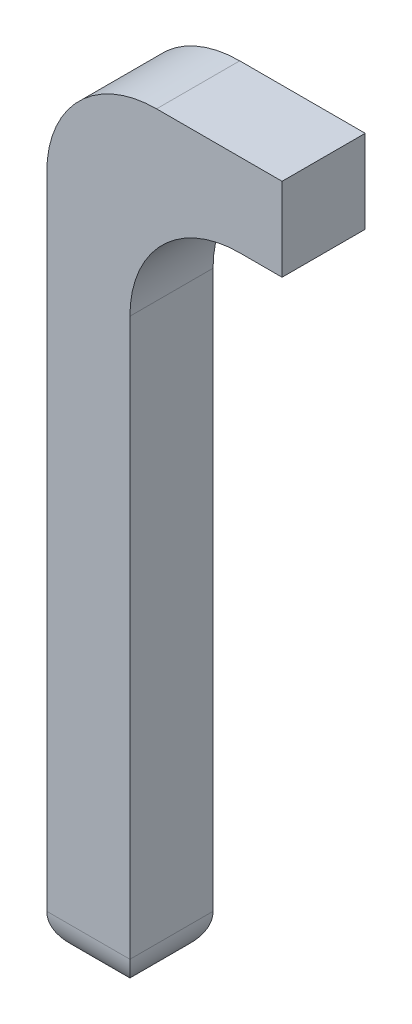
ISO-10303-21;
HEADER;
FILE_DESCRIPTION(('STEP AP214'),'2;1');
FILE_NAME('part.step','',(''),(''),'','','');
FILE_SCHEMA(('AUTOMOTIVE_DESIGN { 1 0 10303 214 1 1 1 1 }'));
ENDSEC;
DATA;
#1=APPLICATION_CONTEXT('core data for automotive mechanical design processes');
#2=APPLICATION_PROTOCOL_DEFINITION('international standard','automotive_design',2000,#1);
#3=PRODUCT_CONTEXT('',#1,'mechanical');
#4=PRODUCT('Part','Part','',(#3));
#5=PRODUCT_RELATED_PRODUCT_CATEGORY('part','',(#4));
#6=PRODUCT_DEFINITION_FORMATION('','',#4);
#7=PRODUCT_DEFINITION_CONTEXT('part definition',#1,'design');
#8=PRODUCT_DEFINITION('design','',#6,#7);
#9=PRODUCT_DEFINITION_SHAPE('','',#8);
#10=(LENGTH_UNIT() NAMED_UNIT(*) SI_UNIT(.MILLI.,.METRE.));
#11=(NAMED_UNIT(*) PLANE_ANGLE_UNIT() SI_UNIT($,.RADIAN.));
#12=(NAMED_UNIT(*) SI_UNIT($,.STERADIAN.) SOLID_ANGLE_UNIT());
#13=UNCERTAINTY_MEASURE_WITH_UNIT(LENGTH_MEASURE(1.E-05),#10,'distance_accuracy_value','');
#14=(GEOMETRIC_REPRESENTATION_CONTEXT(3) GLOBAL_UNCERTAINTY_ASSIGNED_CONTEXT((#13)) GLOBAL_UNIT_ASSIGNED_CONTEXT((#10,
#11,#12)) REPRESENTATION_CONTEXT('',''));
#15=CARTESIAN_POINT('',(0.,0.,0.));
#16=DIRECTION('',(0.,0.,1.));
#17=DIRECTION('',(1.,0.,0.));
#18=AXIS2_PLACEMENT_3D('',#15,#16,#17);
#19=CARTESIAN_POINT('',(10.4,-0.4,9.7625));
#20=DIRECTION('',(0.,0.,1.));
#21=DIRECTION('',(0.707106781186548,-0.707106781186548,0.));
#22=AXIS2_PLACEMENT_3D('',#19,#20,#21);
#23=CYLINDRICAL_SURFACE('',#22,0.25);
#24=DIRECTION('',(0.,0.,-1.));
#25=VECTOR('',#24,1.);
#26=CARTESIAN_POINT('',(10.4,-0.65,9.7625));
#27=LINE('',#26,#25);
#28=CARTESIAN_POINT('',(10.4,-0.65,9.91));
#29=VERTEX_POINT('',#28);
#30=CARTESIAN_POINT('',(10.4,-0.65,9.88));
#31=VERTEX_POINT('',#30);
#32=EDGE_CURVE('E11',#29,#31,#27,.T.);
#33=ORIENTED_EDGE('',*,*,#32,.T.);
#34=CARTESIAN_POINT('',(10.4,-0.4,9.88));
#35=DIRECTION('',(0.707106781186548,0.,0.707106781186548));
#36=DIRECTION('',(0.707106781186548,0.,-0.707106781186548));
#37=AXIS2_PLACEMENT_3D('',#34,#35,#36);
#38=ELLIPSE('',#37,0.353553390593,0.25);
#39=CARTESIAN_POINT('',(10.65,-0.4,9.63));
#40=VERTEX_POINT('',#39);
#41=EDGE_CURVE('E27',#31,#40,#38,.T.);
#42=ORIENTED_EDGE('',*,*,#41,.T.);
#43=DIRECTION('',(0.,0.,1.));
#44=VECTOR('',#43,1.);
#45=CARTESIAN_POINT('',(10.65,-0.4,9.7625));
#46=LINE('',#45,#44);
#47=CARTESIAN_POINT('',(10.65,-0.4,10.16));
#48=VERTEX_POINT('',#47);
#49=EDGE_CURVE('E174',#40,#48,#46,.T.);
#50=ORIENTED_EDGE('',*,*,#49,.T.);
#51=CARTESIAN_POINT('',(10.4,-0.4,9.91));
#52=DIRECTION('',(-0.707106781186548,0.,0.707106781186548));
#53=DIRECTION('',(0.707106781186548,0.,0.707106781186548));
#54=AXIS2_PLACEMENT_3D('',#51,#52,#53);
#55=ELLIPSE('',#54,0.353553390593,0.25);
#56=EDGE_CURVE('E134',#29,#48,#55,.T.);
#57=ORIENTED_EDGE('',*,*,#56,.F.);
#58=EDGE_LOOP('',(#33,#42,#50,#57));
#59=FACE_BOUND('',#58,.T.);
#60=ADVANCED_FACE('F17',(#59),#23,.T.);
#61=CARTESIAN_POINT('',(11.0025,-0.4,9.88));
#62=DIRECTION('',(1.,0.,0.));
#63=DIRECTION('',(0.,-0.707106781186548,-0.707106781186548));
#64=AXIS2_PLACEMENT_3D('',#61,#62,#63);
#65=CYLINDRICAL_SURFACE('',#64,0.25);
#66=DIRECTION('',(-1.,0.,0.));
#67=VECTOR('',#66,1.);
#68=CARTESIAN_POINT('',(11.0025,-0.65,9.88));
#69=LINE('',#68,#67);
#70=CARTESIAN_POINT('',(10.37,-0.65,9.88));
#71=VERTEX_POINT('',#70);
#72=EDGE_CURVE('E169',#31,#71,#69,.T.);
#73=ORIENTED_EDGE('',*,*,#72,.T.);
#74=CARTESIAN_POINT('',(10.37,-0.4,9.88));
#75=DIRECTION('',(0.707106781186548,0.,-0.707106781186548));
#76=DIRECTION('',(-0.707106781186548,0.,-0.707106781186548));
#77=AXIS2_PLACEMENT_3D('',#74,#75,#76);
#78=ELLIPSE('',#77,0.353553390593,0.25);
#79=CARTESIAN_POINT('',(10.12,-0.4,9.63));
#80=VERTEX_POINT('',#79);
#81=EDGE_CURVE('E164',#71,#80,#78,.T.);
#82=ORIENTED_EDGE('',*,*,#81,.T.);
#83=DIRECTION('',(1.,0.,0.));
#84=VECTOR('',#83,1.);
#85=CARTESIAN_POINT('',(11.0025,-0.4,9.63));
#86=LINE('',#85,#84);
#87=EDGE_CURVE('E161',#80,#40,#86,.T.);
#88=ORIENTED_EDGE('',*,*,#87,.T.);
#89=ORIENTED_EDGE('',*,*,#41,.F.);
#90=EDGE_LOOP('',(#73,#82,#88,#89));
#91=FACE_BOUND('',#90,.T.);
#92=ADVANCED_FACE('F167',(#91),#65,.T.);
#93=CARTESIAN_POINT('',(10.37,-0.4,9.895));
#94=DIRECTION('',(0.,0.,-1.));
#95=DIRECTION('',(-0.707106781186548,-0.707106781186548,0.));
#96=AXIS2_PLACEMENT_3D('',#93,#94,#95);
#97=CYLINDRICAL_SURFACE('',#96,0.25);
#98=DIRECTION('',(0.,0.,1.));
#99=VECTOR('',#98,1.);
#100=CARTESIAN_POINT('',(10.37,-0.65,9.895));
#101=LINE('',#100,#99);
#102=CARTESIAN_POINT('',(10.37,-0.65,9.91));
#103=VERTEX_POINT('',#102);
#104=EDGE_CURVE('E165',#71,#103,#101,.T.);
#105=ORIENTED_EDGE('',*,*,#104,.T.);
#106=CARTESIAN_POINT('',(10.37,-0.4,9.91));
#107=DIRECTION('',(-0.707106781186548,0.,-0.707106781186548));
#108=DIRECTION('',(-0.707106781186548,0.,0.707106781186548));
#109=AXIS2_PLACEMENT_3D('',#106,#107,#108);
#110=ELLIPSE('',#109,0.353553390593,0.25);
#111=CARTESIAN_POINT('',(10.12,-0.4,10.16));
#112=VERTEX_POINT('',#111);
#113=EDGE_CURVE('E179',#103,#112,#110,.T.);
#114=ORIENTED_EDGE('',*,*,#113,.T.);
#115=DIRECTION('',(0.,0.,-1.));
#116=VECTOR('',#115,1.);
#117=CARTESIAN_POINT('',(10.12,-0.4,9.895));
#118=LINE('',#117,#116);
#119=EDGE_CURVE('E158',#112,#80,#118,.T.);
#120=ORIENTED_EDGE('',*,*,#119,.T.);
#121=ORIENTED_EDGE('',*,*,#81,.F.);
#122=EDGE_LOOP('',(#105,#114,#120,#121));
#123=FACE_BOUND('',#122,.T.);
#124=ADVANCED_FACE('F205',(#123),#97,.T.);
#125=CARTESIAN_POINT('',(11.0025,-0.4,9.91));
#126=DIRECTION('',(-1.,0.,0.));
#127=DIRECTION('',(0.,-0.707106781186548,0.707106781186548));
#128=AXIS2_PLACEMENT_3D('',#125,#126,#127);
#129=CYLINDRICAL_SURFACE('',#128,0.25);
#130=DIRECTION('',(-1.,0.,0.));
#131=VECTOR('',#130,1.);
#132=CARTESIAN_POINT('',(11.0025,-0.4,10.16));
#133=LINE('',#132,#131);
#134=EDGE_CURVE('E182',#48,#112,#133,.T.);
#135=ORIENTED_EDGE('',*,*,#134,.T.);
#136=ORIENTED_EDGE('',*,*,#113,.F.);
#137=DIRECTION('',(1.,0.,0.));
#138=VECTOR('',#137,1.);
#139=CARTESIAN_POINT('',(11.0025,-0.65,9.91));
#140=LINE('',#139,#138);
#141=EDGE_CURVE('E184',#103,#29,#140,.T.);
#142=ORIENTED_EDGE('',*,*,#141,.T.);
#143=ORIENTED_EDGE('',*,*,#56,.T.);
#144=EDGE_LOOP('',(#135,#136,#142,#143));
#145=FACE_BOUND('',#144,.T.);
#146=ADVANCED_FACE('F201',(#145),#129,.T.);
#147=CARTESIAN_POINT('',(11.62,3.85,10.16));
#148=DIRECTION('',(0.,0.,1.));
#149=DIRECTION('',(0.,1.,0.));
#150=AXIS2_PLACEMENT_3D('',#147,#148,#149);
#151=PLANE('',#150);
#152=ORIENTED_EDGE('',*,*,#134,.F.);
#153=DIRECTION('',(0.,-1.,0.));
#154=VECTOR('',#153,1.);
#155=CARTESIAN_POINT('',(10.65,3.85,10.16));
#156=LINE('',#155,#154);
#157=CARTESIAN_POINT('',(10.65,3.15,10.16));
#158=VERTEX_POINT('',#157);
#159=EDGE_CURVE('E142',#158,#48,#156,.T.);
#160=ORIENTED_EDGE('',*,*,#159,.F.);
#161=CARTESIAN_POINT('',(11.35,3.15,10.16));
#162=DIRECTION('',(0.,0.,1.));
#163=DIRECTION('',(-0.707106781186548,0.707106781186548,0.));
#164=AXIS2_PLACEMENT_3D('',#161,#162,#163);
#165=CIRCLE('',#164,0.7);
#166=CARTESIAN_POINT('',(11.35,3.85,10.16));
#167=VERTEX_POINT('',#166);
#168=EDGE_CURVE('E144',#167,#158,#165,.T.);
#169=ORIENTED_EDGE('',*,*,#168,.F.);
#170=DIRECTION('',(-1.,0.,0.));
#171=VECTOR('',#170,1.);
#172=CARTESIAN_POINT('',(11.62,3.85,10.16));
#173=LINE('',#172,#171);
#174=CARTESIAN_POINT('',(11.62,3.85,10.16));
#175=VERTEX_POINT('',#174);
#176=EDGE_CURVE('E115',#175,#167,#173,.T.);
#177=ORIENTED_EDGE('',*,*,#176,.F.);
#178=DIRECTION('',(0.,-1.,0.));
#179=VECTOR('',#178,1.);
#180=CARTESIAN_POINT('',(11.62,4.38,10.16));
#181=LINE('',#180,#179);
#182=CARTESIAN_POINT('',(11.62,4.38,10.16));
#183=VERTEX_POINT('',#182);
#184=EDGE_CURVE('E123',#183,#175,#181,.T.);
#185=ORIENTED_EDGE('',*,*,#184,.F.);
#186=DIRECTION('',(-1.,0.,0.));
#187=VECTOR('',#186,1.);
#188=CARTESIAN_POINT('',(11.62,4.38,10.16));
#189=LINE('',#188,#187);
#190=CARTESIAN_POINT('',(10.82,4.38,10.16));
#191=VERTEX_POINT('',#190);
#192=EDGE_CURVE('E131',#183,#191,#189,.T.);
#193=ORIENTED_EDGE('',*,*,#192,.T.);
#194=CARTESIAN_POINT('',(10.82,3.68,10.16));
#195=DIRECTION('',(0.,0.,-1.));
#196=DIRECTION('',(-0.707106781186548,0.707106781186548,0.));
#197=AXIS2_PLACEMENT_3D('',#194,#195,#196);
#198=CIRCLE('',#197,0.7);
#199=CARTESIAN_POINT('',(10.12,3.68,10.16));
#200=VERTEX_POINT('',#199);
#201=EDGE_CURVE('E136',#200,#191,#198,.T.);
#202=ORIENTED_EDGE('',*,*,#201,.F.);
#203=DIRECTION('',(0.,-1.,0.));
#204=VECTOR('',#203,1.);
#205=CARTESIAN_POINT('',(10.12,3.85,10.16));
#206=LINE('',#205,#204);
#207=EDGE_CURVE('E135',#200,#112,#206,.T.);
#208=ORIENTED_EDGE('',*,*,#207,.T.);
#209=EDGE_LOOP('',(#152,#160,#169,#177,#185,#193,#202,#208));
#210=FACE_BOUND('',#209,.T.);
#211=ADVANCED_FACE('F191',(#210),#151,.T.);
#212=CARTESIAN_POINT('',(10.65,3.85,9.63));
#213=DIRECTION('',(1.,0.,0.));
#214=DIRECTION('',(0.,0.,1.));
#215=AXIS2_PLACEMENT_3D('',#212,#213,#214);
#216=PLANE('',#215);
#217=ORIENTED_EDGE('',*,*,#49,.F.);
#218=DIRECTION('',(0.,-1.,0.));
#219=VECTOR('',#218,1.);
#220=CARTESIAN_POINT('',(10.65,3.85,9.63));
#221=LINE('',#220,#219);
#222=CARTESIAN_POINT('',(10.65,3.15,9.63));
#223=VERTEX_POINT('',#222);
#224=EDGE_CURVE('E111',#223,#40,#221,.T.);
#225=ORIENTED_EDGE('',*,*,#224,.F.);
#226=DIRECTION('',(0.,0.,-1.));
#227=VECTOR('',#226,1.);
#228=CARTESIAN_POINT('',(10.65,3.15,9.63));
#229=LINE('',#228,#227);
#230=EDGE_CURVE('E100',#158,#223,#229,.T.);
#231=ORIENTED_EDGE('',*,*,#230,.F.);
#232=ORIENTED_EDGE('',*,*,#159,.T.);
#233=EDGE_LOOP('',(#217,#225,#231,#232));
#234=FACE_BOUND('',#233,.T.);
#235=ADVANCED_FACE('F194',(#234),#216,.T.);
#236=CARTESIAN_POINT('',(10.385,-0.65,9.895));
#237=DIRECTION('',(0.,-1.,0.));
#238=DIRECTION('',(0.,0.,-1.));
#239=AXIS2_PLACEMENT_3D('',#236,#237,#238);
#240=PLANE('',#239);
#241=ORIENTED_EDGE('',*,*,#32,.F.);
#242=ORIENTED_EDGE('',*,*,#141,.F.);
#243=ORIENTED_EDGE('',*,*,#104,.F.);
#244=ORIENTED_EDGE('',*,*,#72,.F.);
#245=EDGE_LOOP('',(#241,#242,#243,#244));
#246=FACE_BOUND('',#245,.T.);
#247=ADVANCED_FACE('F204',(#246),#240,.T.);
#248=CARTESIAN_POINT('',(10.82,3.68,10.0275));
#249=DIRECTION('',(0.,0.,-1.));
#250=DIRECTION('',(-0.707106781186548,0.707106781186548,0.));
#251=AXIS2_PLACEMENT_3D('',#248,#249,#250);
#252=CYLINDRICAL_SURFACE('',#251,0.7);
#253=CARTESIAN_POINT('',(10.82,3.68,9.63));
#254=DIRECTION('',(0.,0.,1.));
#255=DIRECTION('',(-0.707106781186548,0.707106781186548,0.));
#256=AXIS2_PLACEMENT_3D('',#253,#254,#255);
#257=CIRCLE('',#256,0.7);
#258=CARTESIAN_POINT('',(10.82,4.38,9.63));
#259=VERTEX_POINT('',#258);
#260=CARTESIAN_POINT('',(10.12,3.68,9.63));
#261=VERTEX_POINT('',#260);
#262=EDGE_CURVE('E146',#259,#261,#257,.T.);
#263=ORIENTED_EDGE('',*,*,#262,.T.);
#264=DIRECTION('',(0.,0.,1.));
#265=VECTOR('',#264,1.);
#266=CARTESIAN_POINT('',(10.12,3.68,10.0275));
#267=LINE('',#266,#265);
#268=EDGE_CURVE('E138',#261,#200,#267,.T.);
#269=ORIENTED_EDGE('',*,*,#268,.T.);
#270=ORIENTED_EDGE('',*,*,#201,.T.);
#271=DIRECTION('',(0.,0.,-1.));
#272=VECTOR('',#271,1.);
#273=CARTESIAN_POINT('',(10.82,4.38,10.0275));
#274=LINE('',#273,#272);
#275=EDGE_CURVE('E139',#191,#259,#274,.T.);
#276=ORIENTED_EDGE('',*,*,#275,.T.);
#277=EDGE_LOOP('',(#263,#269,#270,#276));
#278=FACE_BOUND('',#277,.T.);
#279=ADVANCED_FACE('F207',(#278),#252,.T.);
#280=CARTESIAN_POINT('',(10.12,4.115,9.895));
#281=DIRECTION('',(-1.,0.,0.));
#282=DIRECTION('',(0.,0.,1.));
#283=AXIS2_PLACEMENT_3D('',#280,#281,#282);
#284=PLANE('',#283);
#285=ORIENTED_EDGE('',*,*,#119,.F.);
#286=ORIENTED_EDGE('',*,*,#207,.F.);
#287=ORIENTED_EDGE('',*,*,#268,.F.);
#288=DIRECTION('',(0.,-1.,0.));
#289=VECTOR('',#288,1.);
#290=CARTESIAN_POINT('',(10.12,3.85,9.63));
#291=LINE('',#290,#289);
#292=EDGE_CURVE('E110',#261,#80,#291,.T.);
#293=ORIENTED_EDGE('',*,*,#292,.T.);
#294=EDGE_LOOP('',(#285,#286,#287,#293));
#295=FACE_BOUND('',#294,.T.);
#296=ADVANCED_FACE('F156',(#295),#284,.T.);
#297=CARTESIAN_POINT('',(11.62,4.38,9.63));
#298=DIRECTION('',(0.,0.,-1.));
#299=DIRECTION('',(0.,-1.,0.));
#300=AXIS2_PLACEMENT_3D('',#297,#298,#299);
#301=PLANE('',#300);
#302=ORIENTED_EDGE('',*,*,#87,.F.);
#303=ORIENTED_EDGE('',*,*,#292,.F.);
#304=ORIENTED_EDGE('',*,*,#262,.F.);
#305=DIRECTION('',(-1.,0.,0.));
#306=VECTOR('',#305,1.);
#307=CARTESIAN_POINT('',(11.62,4.38,9.63));
#308=LINE('',#307,#306);
#309=CARTESIAN_POINT('',(11.62,4.38,9.63));
#310=VERTEX_POINT('',#309);
#311=EDGE_CURVE('E117',#310,#259,#308,.T.);
#312=ORIENTED_EDGE('',*,*,#311,.F.);
#313=DIRECTION('',(0.,1.,0.));
#314=VECTOR('',#313,1.);
#315=CARTESIAN_POINT('',(11.62,3.85,9.63));
#316=LINE('',#315,#314);
#317=CARTESIAN_POINT('',(11.62,3.85,9.63));
#318=VERTEX_POINT('',#317);
#319=EDGE_CURVE('E89',#318,#310,#316,.T.);
#320=ORIENTED_EDGE('',*,*,#319,.F.);
#321=DIRECTION('',(-1.,0.,0.));
#322=VECTOR('',#321,1.);
#323=CARTESIAN_POINT('',(11.62,3.85,9.63));
#324=LINE('',#323,#322);
#325=CARTESIAN_POINT('',(11.35,3.85,9.63));
#326=VERTEX_POINT('',#325);
#327=EDGE_CURVE('E104',#318,#326,#324,.T.);
#328=ORIENTED_EDGE('',*,*,#327,.T.);
#329=CARTESIAN_POINT('',(11.35,3.15,9.63));
#330=DIRECTION('',(0.,0.,-1.));
#331=DIRECTION('',(-0.707106781186548,0.707106781186548,0.));
#332=AXIS2_PLACEMENT_3D('',#329,#330,#331);
#333=CIRCLE('',#332,0.7);
#334=EDGE_CURVE('E95',#223,#326,#333,.T.);
#335=ORIENTED_EDGE('',*,*,#334,.F.);
#336=ORIENTED_EDGE('',*,*,#224,.T.);
#337=EDGE_LOOP('',(#302,#303,#304,#312,#320,#328,#335,#336));
#338=FACE_BOUND('',#337,.T.);
#339=ADVANCED_FACE('F106',(#338),#301,.T.);
#340=CARTESIAN_POINT('',(11.35,3.15,9.63));
#341=DIRECTION('',(0.,0.,-1.));
#342=DIRECTION('',(-0.707106781186548,0.707106781186548,0.));
#343=AXIS2_PLACEMENT_3D('',#340,#341,#342);
#344=CYLINDRICAL_SURFACE('',#343,0.7);
#345=ORIENTED_EDGE('',*,*,#168,.T.);
#346=ORIENTED_EDGE('',*,*,#230,.T.);
#347=ORIENTED_EDGE('',*,*,#334,.T.);
#348=DIRECTION('',(0.,0.,1.));
#349=VECTOR('',#348,1.);
#350=CARTESIAN_POINT('',(11.35,3.85,9.63));
#351=LINE('',#350,#349);
#352=EDGE_CURVE('E98',#326,#167,#351,.T.);
#353=ORIENTED_EDGE('',*,*,#352,.T.);
#354=EDGE_LOOP('',(#345,#346,#347,#353));
#355=FACE_BOUND('',#354,.T.);
#356=ADVANCED_FACE('F96',(#355),#344,.F.);
#357=CARTESIAN_POINT('',(11.62,4.38,10.16));
#358=DIRECTION('',(0.,1.,0.));
#359=DIRECTION('',(0.,0.,-1.));
#360=AXIS2_PLACEMENT_3D('',#357,#358,#359);
#361=PLANE('',#360);
#362=ORIENTED_EDGE('',*,*,#275,.F.);
#363=ORIENTED_EDGE('',*,*,#192,.F.);
#364=DIRECTION('',(0.,0.,1.));
#365=VECTOR('',#364,1.);
#366=CARTESIAN_POINT('',(11.62,4.38,9.63));
#367=LINE('',#366,#365);
#368=EDGE_CURVE('E121',#310,#183,#367,.T.);
#369=ORIENTED_EDGE('',*,*,#368,.F.);
#370=ORIENTED_EDGE('',*,*,#311,.T.);
#371=EDGE_LOOP('',(#362,#363,#369,#370));
#372=FACE_BOUND('',#371,.T.);
#373=ADVANCED_FACE('F211',(#372),#361,.T.);
#374=CARTESIAN_POINT('',(11.62,3.85,9.63));
#375=DIRECTION('',(0.,-1.,0.));
#376=DIRECTION('',(0.,0.,1.));
#377=AXIS2_PLACEMENT_3D('',#374,#375,#376);
#378=PLANE('',#377);
#379=ORIENTED_EDGE('',*,*,#352,.F.);
#380=ORIENTED_EDGE('',*,*,#327,.F.);
#381=DIRECTION('',(0.,0.,-1.));
#382=VECTOR('',#381,1.);
#383=CARTESIAN_POINT('',(11.62,3.85,10.16));
#384=LINE('',#383,#382);
#385=EDGE_CURVE('E21',#175,#318,#384,.T.);
#386=ORIENTED_EDGE('',*,*,#385,.F.);
#387=ORIENTED_EDGE('',*,*,#176,.T.);
#388=EDGE_LOOP('',(#379,#380,#386,#387));
#389=FACE_BOUND('',#388,.T.);
#390=ADVANCED_FACE('F113',(#389),#378,.T.);
#391=CARTESIAN_POINT('',(11.62,4.115,9.895));
#392=DIRECTION('',(-1.,0.,0.));
#393=DIRECTION('',(0.,0.,1.));
#394=AXIS2_PLACEMENT_3D('',#391,#392,#393);
#395=PLANE('',#394);
#396=ORIENTED_EDGE('',*,*,#385,.T.);
#397=ORIENTED_EDGE('',*,*,#319,.T.);
#398=ORIENTED_EDGE('',*,*,#368,.T.);
#399=ORIENTED_EDGE('',*,*,#184,.T.);
#400=EDGE_LOOP('',(#396,#397,#398,#399));
#401=FACE_BOUND('',#400,.T.);
#402=ADVANCED_FACE('F19',(#401),#395,.F.);
#403=CLOSED_SHELL('',(#60,#92,#124,#146,#211,#235,#247,#279,#296,#339,#356,#373,#390,#402));
#404=MANIFOLD_SOLID_BREP('B1',#403);
#405=ADVANCED_BREP_SHAPE_REPRESENTATION('',(#18,#404),#14);
#406=SHAPE_DEFINITION_REPRESENTATION(#9,#405);
ENDSEC;
END-ISO-10303-21;
